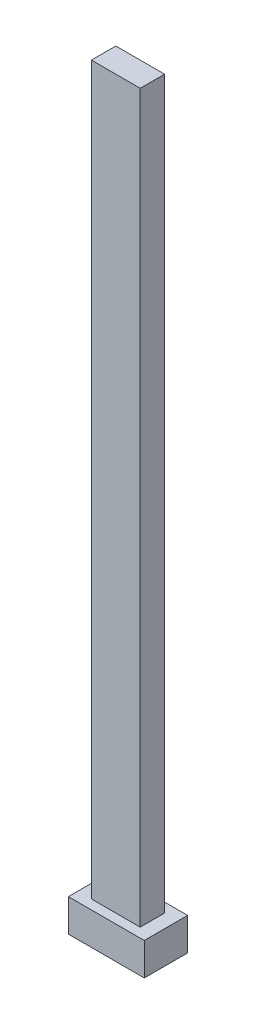
ISO-10303-21;
HEADER;
FILE_DESCRIPTION(('STEP AP214'),'2;1');
FILE_NAME('part.step','',(''),(''),'','','');
FILE_SCHEMA(('AUTOMOTIVE_DESIGN { 1 0 10303 214 1 1 1 1 }'));
ENDSEC;
DATA;
#1=APPLICATION_CONTEXT('core data for automotive mechanical design processes');
#2=APPLICATION_PROTOCOL_DEFINITION('international standard','automotive_design',2000,#1);
#3=PRODUCT_CONTEXT('',#1,'mechanical');
#4=PRODUCT('Part','Part','',(#3));
#5=PRODUCT_RELATED_PRODUCT_CATEGORY('part','',(#4));
#6=PRODUCT_DEFINITION_FORMATION('','',#4);
#7=PRODUCT_DEFINITION_CONTEXT('part definition',#1,'design');
#8=PRODUCT_DEFINITION('design','',#6,#7);
#9=PRODUCT_DEFINITION_SHAPE('','',#8);
#10=(LENGTH_UNIT() NAMED_UNIT(*) SI_UNIT(.MILLI.,.METRE.));
#11=(NAMED_UNIT(*) PLANE_ANGLE_UNIT() SI_UNIT($,.RADIAN.));
#12=(NAMED_UNIT(*) SI_UNIT($,.STERADIAN.) SOLID_ANGLE_UNIT());
#13=UNCERTAINTY_MEASURE_WITH_UNIT(LENGTH_MEASURE(1.E-05),#10,'distance_accuracy_value','');
#14=(GEOMETRIC_REPRESENTATION_CONTEXT(3) GLOBAL_UNCERTAINTY_ASSIGNED_CONTEXT((#13)) GLOBAL_UNIT_ASSIGNED_CONTEXT((#10,
#11,#12)) REPRESENTATION_CONTEXT('',''));
#15=CARTESIAN_POINT('',(0.,0.,0.));
#16=DIRECTION('',(0.,0.,1.));
#17=DIRECTION('',(1.,0.,0.));
#18=AXIS2_PLACEMENT_3D('',#15,#16,#17);
#19=CARTESIAN_POINT('',(0.,3.,0.));
#20=DIRECTION('',(0.,-1.,0.));
#21=DIRECTION('',(0.,0.,-1.));
#22=AXIS2_PLACEMENT_3D('',#19,#20,#21);
#23=PLANE('',#22);
#24=DIRECTION('',(0.,0.,1.));
#25=VECTOR('',#24,1.);
#26=CARTESIAN_POINT('',(-3.5,3.,-2.));
#27=LINE('',#26,#25);
#28=CARTESIAN_POINT('',(-3.5,3.,-2.));
#29=VERTEX_POINT('',#28);
#30=CARTESIAN_POINT('',(-3.5,3.,2.));
#31=VERTEX_POINT('',#30);
#32=EDGE_CURVE('E171',#29,#31,#27,.T.);
#33=ORIENTED_EDGE('',*,*,#32,.T.);
#34=DIRECTION('',(1.,0.,0.));
#35=VECTOR('',#34,1.);
#36=CARTESIAN_POINT('',(3.5,3.,2.));
#37=LINE('',#36,#35);
#38=CARTESIAN_POINT('',(3.5,3.,2.));
#39=VERTEX_POINT('',#38);
#40=EDGE_CURVE('E96',#31,#39,#37,.T.);
#41=ORIENTED_EDGE('',*,*,#40,.T.);
#42=DIRECTION('',(0.,0.,-1.));
#43=VECTOR('',#42,1.);
#44=CARTESIAN_POINT('',(3.5,3.,-2.));
#45=LINE('',#44,#43);
#46=CARTESIAN_POINT('',(3.5,3.,-2.));
#47=VERTEX_POINT('',#46);
#48=EDGE_CURVE('E176',#39,#47,#45,.T.);
#49=ORIENTED_EDGE('',*,*,#48,.T.);
#50=DIRECTION('',(-1.,0.,0.));
#51=VECTOR('',#50,1.);
#52=CARTESIAN_POINT('',(3.5,3.,-2.));
#53=LINE('',#52,#51);
#54=EDGE_CURVE('E65',#47,#29,#53,.T.);
#55=ORIENTED_EDGE('',*,*,#54,.T.);
#56=EDGE_LOOP('',(#33,#41,#49,#55));
#57=FACE_BOUND('',#56,.T.);
#58=DIRECTION('',(0.,0.,1.));
#59=VECTOR('',#58,1.);
#60=CARTESIAN_POINT('',(-2.25,3.,-1.125));
#61=LINE('',#60,#59);
#62=CARTESIAN_POINT('',(-2.25,3.,-1.125));
#63=VERTEX_POINT('',#62);
#64=CARTESIAN_POINT('',(-2.25,3.,1.125));
#65=VERTEX_POINT('',#64);
#66=EDGE_CURVE('E151',#63,#65,#61,.T.);
#67=ORIENTED_EDGE('',*,*,#66,.F.);
#68=DIRECTION('',(-1.,0.,0.));
#69=VECTOR('',#68,1.);
#70=CARTESIAN_POINT('',(2.25,3.,-1.125));
#71=LINE('',#70,#69);
#72=CARTESIAN_POINT('',(2.25,3.,-1.125));
#73=VERTEX_POINT('',#72);
#74=EDGE_CURVE('E149',#73,#63,#71,.T.);
#75=ORIENTED_EDGE('',*,*,#74,.F.);
#76=DIRECTION('',(0.,0.,-1.));
#77=VECTOR('',#76,1.);
#78=CARTESIAN_POINT('',(2.25,3.,-1.125));
#79=LINE('',#78,#77);
#80=CARTESIAN_POINT('',(2.25,3.,1.125));
#81=VERTEX_POINT('',#80);
#82=EDGE_CURVE('E164',#81,#73,#79,.T.);
#83=ORIENTED_EDGE('',*,*,#82,.F.);
#84=DIRECTION('',(1.,0.,0.));
#85=VECTOR('',#84,1.);
#86=CARTESIAN_POINT('',(2.25,3.,1.125));
#87=LINE('',#86,#85);
#88=EDGE_CURVE('E155',#65,#81,#87,.T.);
#89=ORIENTED_EDGE('',*,*,#88,.F.);
#90=EDGE_LOOP('',(#67,#75,#83,#89));
#91=FACE_BOUND('',#90,.T.);
#92=ADVANCED_FACE('F47',(#57,#91),#23,.F.);
#93=CARTESIAN_POINT('',(0.,0.,0.));
#94=DIRECTION('',(0.,-1.,0.));
#95=DIRECTION('',(0.,0.,-1.));
#96=AXIS2_PLACEMENT_3D('',#93,#94,#95);
#97=PLANE('',#96);
#98=DIRECTION('',(0.,0.,1.));
#99=VECTOR('',#98,1.);
#100=CARTESIAN_POINT('',(-3.5,0.,-2.));
#101=LINE('',#100,#99);
#102=CARTESIAN_POINT('',(-3.5,0.,-2.));
#103=VERTEX_POINT('',#102);
#104=CARTESIAN_POINT('',(-3.5,0.,2.));
#105=VERTEX_POINT('',#104);
#106=EDGE_CURVE('E170',#103,#105,#101,.T.);
#107=ORIENTED_EDGE('',*,*,#106,.F.);
#108=DIRECTION('',(-1.,0.,0.));
#109=VECTOR('',#108,1.);
#110=CARTESIAN_POINT('',(3.5,0.,-2.));
#111=LINE('',#110,#109);
#112=CARTESIAN_POINT('',(3.5,0.,-2.));
#113=VERTEX_POINT('',#112);
#114=EDGE_CURVE('E89',#113,#103,#111,.T.);
#115=ORIENTED_EDGE('',*,*,#114,.F.);
#116=DIRECTION('',(0.,0.,-1.));
#117=VECTOR('',#116,1.);
#118=CARTESIAN_POINT('',(3.5,0.,-2.));
#119=LINE('',#118,#117);
#120=CARTESIAN_POINT('',(3.5,0.,2.));
#121=VERTEX_POINT('',#120);
#122=EDGE_CURVE('E83',#121,#113,#119,.T.);
#123=ORIENTED_EDGE('',*,*,#122,.F.);
#124=DIRECTION('',(1.,0.,0.));
#125=VECTOR('',#124,1.);
#126=CARTESIAN_POINT('',(3.5,0.,2.));
#127=LINE('',#126,#125);
#128=EDGE_CURVE('E185',#105,#121,#127,.T.);
#129=ORIENTED_EDGE('',*,*,#128,.F.);
#130=EDGE_LOOP('',(#107,#115,#123,#129));
#131=FACE_BOUND('',#130,.T.);
#132=ADVANCED_FACE('F201',(#131),#97,.T.);
#133=CARTESIAN_POINT('',(-3.5,3.,-2.));
#134=DIRECTION('',(1.,0.,0.));
#135=DIRECTION('',(0.,0.,-1.));
#136=AXIS2_PLACEMENT_3D('',#133,#134,#135);
#137=PLANE('',#136);
#138=ORIENTED_EDGE('',*,*,#106,.T.);
#139=DIRECTION('',(0.,-1.,0.));
#140=VECTOR('',#139,1.);
#141=CARTESIAN_POINT('',(-3.5,3.,2.));
#142=LINE('',#141,#140);
#143=EDGE_CURVE('E11',#31,#105,#142,.T.);
#144=ORIENTED_EDGE('',*,*,#143,.F.);
#145=ORIENTED_EDGE('',*,*,#32,.F.);
#146=DIRECTION('',(0.,-1.,0.));
#147=VECTOR('',#146,1.);
#148=CARTESIAN_POINT('',(-3.5,3.,-2.));
#149=LINE('',#148,#147);
#150=EDGE_CURVE('E181',#29,#103,#149,.T.);
#151=ORIENTED_EDGE('',*,*,#150,.T.);
#152=EDGE_LOOP('',(#138,#144,#145,#151));
#153=FACE_BOUND('',#152,.T.);
#154=ADVANCED_FACE('F49',(#153),#137,.F.);
#155=CARTESIAN_POINT('',(3.5,3.,2.));
#156=DIRECTION('',(0.,0.,-1.));
#157=DIRECTION('',(-1.,0.,0.));
#158=AXIS2_PLACEMENT_3D('',#155,#156,#157);
#159=PLANE('',#158);
#160=ORIENTED_EDGE('',*,*,#128,.T.);
#161=DIRECTION('',(0.,-1.,0.));
#162=VECTOR('',#161,1.);
#163=CARTESIAN_POINT('',(3.5,3.,2.));
#164=LINE('',#163,#162);
#165=EDGE_CURVE('E57',#39,#121,#164,.T.);
#166=ORIENTED_EDGE('',*,*,#165,.F.);
#167=ORIENTED_EDGE('',*,*,#40,.F.);
#168=ORIENTED_EDGE('',*,*,#143,.T.);
#169=EDGE_LOOP('',(#160,#166,#167,#168));
#170=FACE_BOUND('',#169,.T.);
#171=ADVANCED_FACE('F215',(#170),#159,.F.);
#172=CARTESIAN_POINT('',(3.5,3.,-2.));
#173=DIRECTION('',(-1.,0.,0.));
#174=DIRECTION('',(0.,0.,1.));
#175=AXIS2_PLACEMENT_3D('',#172,#173,#174);
#176=PLANE('',#175);
#177=ORIENTED_EDGE('',*,*,#122,.T.);
#178=DIRECTION('',(0.,-1.,0.));
#179=VECTOR('',#178,1.);
#180=CARTESIAN_POINT('',(3.5,3.,-2.));
#181=LINE('',#180,#179);
#182=EDGE_CURVE('E194',#47,#113,#181,.T.);
#183=ORIENTED_EDGE('',*,*,#182,.F.);
#184=ORIENTED_EDGE('',*,*,#48,.F.);
#185=ORIENTED_EDGE('',*,*,#165,.T.);
#186=EDGE_LOOP('',(#177,#183,#184,#185));
#187=FACE_BOUND('',#186,.T.);
#188=ADVANCED_FACE('F198',(#187),#176,.F.);
#189=CARTESIAN_POINT('',(3.5,3.,-2.));
#190=DIRECTION('',(0.,0.,1.));
#191=DIRECTION('',(1.,0.,0.));
#192=AXIS2_PLACEMENT_3D('',#189,#190,#191);
#193=PLANE('',#192);
#194=ORIENTED_EDGE('',*,*,#114,.T.);
#195=ORIENTED_EDGE('',*,*,#150,.F.);
#196=ORIENTED_EDGE('',*,*,#54,.F.);
#197=ORIENTED_EDGE('',*,*,#182,.T.);
#198=EDGE_LOOP('',(#194,#195,#196,#197));
#199=FACE_BOUND('',#198,.T.);
#200=ADVANCED_FACE('F205',(#199),#193,.F.);
#201=CARTESIAN_POINT('',(0.,70.,-1.125));
#202=DIRECTION('',(0.,0.,1.));
#203=DIRECTION('',(1.,0.,0.));
#204=AXIS2_PLACEMENT_3D('',#201,#202,#203);
#205=PLANE('',#204);
#206=DIRECTION('',(0.,-1.,0.));
#207=VECTOR('',#206,1.);
#208=CARTESIAN_POINT('',(2.25,70.,-1.125));
#209=LINE('',#208,#207);
#210=CARTESIAN_POINT('',(2.25,70.,-1.125));
#211=VERTEX_POINT('',#210);
#212=EDGE_CURVE('E302',#211,#73,#209,.T.);
#213=ORIENTED_EDGE('',*,*,#212,.T.);
#214=ORIENTED_EDGE('',*,*,#74,.T.);
#215=DIRECTION('',(0.,-1.,0.));
#216=VECTOR('',#215,1.);
#217=CARTESIAN_POINT('',(-2.25,70.,-1.125));
#218=LINE('',#217,#216);
#219=CARTESIAN_POINT('',(-2.25,70.,-1.125));
#220=VERTEX_POINT('',#219);
#221=EDGE_CURVE('E128',#220,#63,#218,.T.);
#222=ORIENTED_EDGE('',*,*,#221,.F.);
#223=DIRECTION('',(-1.,0.,0.));
#224=VECTOR('',#223,1.);
#225=CARTESIAN_POINT('',(0.,70.,-1.125));
#226=LINE('',#225,#224);
#227=EDGE_CURVE('E136',#211,#220,#226,.T.);
#228=ORIENTED_EDGE('',*,*,#227,.F.);
#229=EDGE_LOOP('',(#213,#214,#222,#228));
#230=FACE_BOUND('',#229,.T.);
#231=ADVANCED_FACE('F148',(#230),#205,.F.);
#232=CARTESIAN_POINT('',(0.,70.,1.125));
#233=DIRECTION('',(0.,0.,1.));
#234=DIRECTION('',(1.,0.,0.));
#235=AXIS2_PLACEMENT_3D('',#232,#233,#234);
#236=PLANE('',#235);
#237=ORIENTED_EDGE('',*,*,#88,.T.);
#238=DIRECTION('',(0.,-1.,0.));
#239=VECTOR('',#238,1.);
#240=CARTESIAN_POINT('',(2.25,70.,1.125));
#241=LINE('',#240,#239);
#242=CARTESIAN_POINT('',(2.25,70.,1.125));
#243=VERTEX_POINT('',#242);
#244=EDGE_CURVE('E157',#243,#81,#241,.T.);
#245=ORIENTED_EDGE('',*,*,#244,.F.);
#246=DIRECTION('',(-1.,0.,0.));
#247=VECTOR('',#246,1.);
#248=CARTESIAN_POINT('',(0.,70.,1.125));
#249=LINE('',#248,#247);
#250=CARTESIAN_POINT('',(-2.25,70.,1.125));
#251=VERTEX_POINT('',#250);
#252=EDGE_CURVE('E135',#243,#251,#249,.T.);
#253=ORIENTED_EDGE('',*,*,#252,.T.);
#254=DIRECTION('',(0.,-1.,0.));
#255=VECTOR('',#254,1.);
#256=CARTESIAN_POINT('',(-2.25,70.,1.125));
#257=LINE('',#256,#255);
#258=EDGE_CURVE('E130',#251,#65,#257,.T.);
#259=ORIENTED_EDGE('',*,*,#258,.T.);
#260=EDGE_LOOP('',(#237,#245,#253,#259));
#261=FACE_BOUND('',#260,.T.);
#262=ADVANCED_FACE('F213',(#261),#236,.T.);
#263=CARTESIAN_POINT('',(-2.25,70.,0.));
#264=DIRECTION('',(1.,0.,0.));
#265=DIRECTION('',(0.,0.,-1.));
#266=AXIS2_PLACEMENT_3D('',#263,#264,#265);
#267=PLANE('',#266);
#268=ORIENTED_EDGE('',*,*,#221,.T.);
#269=ORIENTED_EDGE('',*,*,#66,.T.);
#270=ORIENTED_EDGE('',*,*,#258,.F.);
#271=DIRECTION('',(0.,0.,1.));
#272=VECTOR('',#271,1.);
#273=CARTESIAN_POINT('',(-2.25,70.,0.));
#274=LINE('',#273,#272);
#275=EDGE_CURVE('E123',#220,#251,#274,.T.);
#276=ORIENTED_EDGE('',*,*,#275,.F.);
#277=EDGE_LOOP('',(#268,#269,#270,#276));
#278=FACE_BOUND('',#277,.T.);
#279=ADVANCED_FACE('F125',(#278),#267,.F.);
#280=CARTESIAN_POINT('',(2.25,70.,0.));
#281=DIRECTION('',(1.,0.,0.));
#282=DIRECTION('',(0.,0.,-1.));
#283=AXIS2_PLACEMENT_3D('',#280,#281,#282);
#284=PLANE('',#283);
#285=ORIENTED_EDGE('',*,*,#82,.T.);
#286=ORIENTED_EDGE('',*,*,#212,.F.);
#287=DIRECTION('',(0.,0.,1.));
#288=VECTOR('',#287,1.);
#289=CARTESIAN_POINT('',(2.25,70.,0.));
#290=LINE('',#289,#288);
#291=EDGE_CURVE('E142',#211,#243,#290,.T.);
#292=ORIENTED_EDGE('',*,*,#291,.T.);
#293=ORIENTED_EDGE('',*,*,#244,.T.);
#294=EDGE_LOOP('',(#285,#286,#292,#293));
#295=FACE_BOUND('',#294,.T.);
#296=ADVANCED_FACE('F226',(#295),#284,.T.);
#297=CARTESIAN_POINT('',(0.,70.,0.));
#298=DIRECTION('',(0.,1.,0.));
#299=DIRECTION('',(0.,0.,1.));
#300=AXIS2_PLACEMENT_3D('',#297,#298,#299);
#301=PLANE('',#300);
#302=ORIENTED_EDGE('',*,*,#227,.T.);
#303=ORIENTED_EDGE('',*,*,#275,.T.);
#304=ORIENTED_EDGE('',*,*,#252,.F.);
#305=ORIENTED_EDGE('',*,*,#291,.F.);
#306=EDGE_LOOP('',(#302,#303,#304,#305));
#307=FACE_BOUND('',#306,.T.);
#308=ADVANCED_FACE('F140',(#307),#301,.T.);
#309=CLOSED_SHELL('',(#92,#132,#154,#171,#188,#200,#231,#262,#279,#296,#308));
#310=MANIFOLD_SOLID_BREP('B2',#309);
#311=ADVANCED_BREP_SHAPE_REPRESENTATION('',(#18,#310),#14);
#312=SHAPE_DEFINITION_REPRESENTATION(#9,#311);
ENDSEC;
END-ISO-10303-21;
